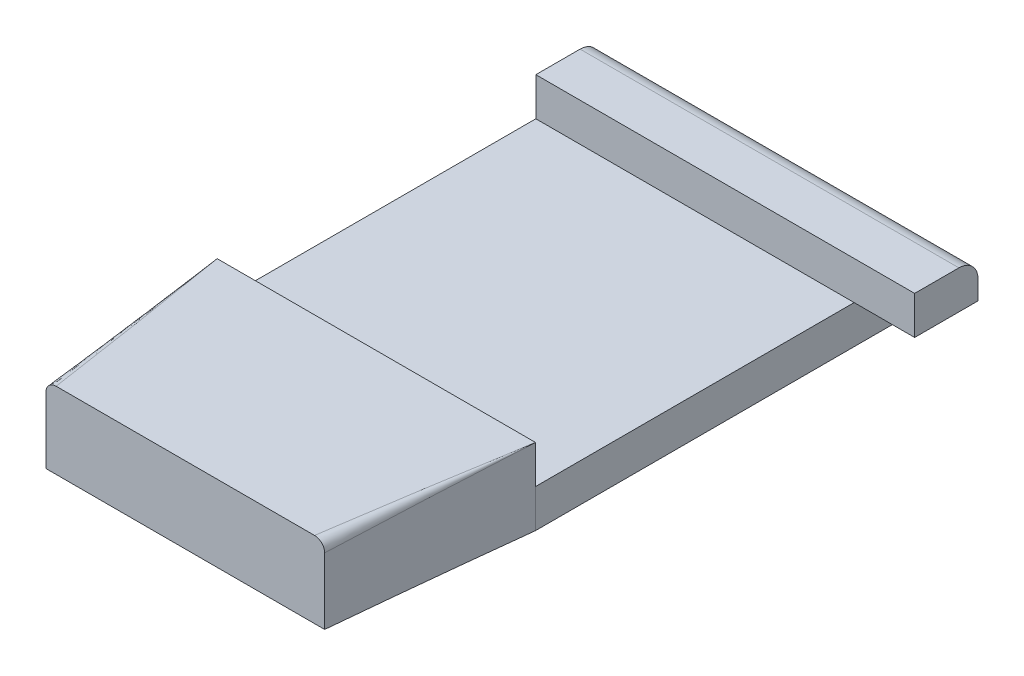
ISO-10303-21;
HEADER;
FILE_DESCRIPTION(('STEP AP214'),'2;1');
FILE_NAME('part.step','',(''),(''),'','','');
FILE_SCHEMA(('AUTOMOTIVE_DESIGN { 1 0 10303 214 1 1 1 1 }'));
ENDSEC;
DATA;
#1=APPLICATION_CONTEXT('core data for automotive mechanical design processes');
#2=APPLICATION_PROTOCOL_DEFINITION('international standard','automotive_design',2000,#1);
#3=PRODUCT_CONTEXT('',#1,'mechanical');
#4=PRODUCT('Part','Part','',(#3));
#5=PRODUCT_RELATED_PRODUCT_CATEGORY('part','',(#4));
#6=PRODUCT_DEFINITION_FORMATION('','',#4);
#7=PRODUCT_DEFINITION_CONTEXT('part definition',#1,'design');
#8=PRODUCT_DEFINITION('design','',#6,#7);
#9=PRODUCT_DEFINITION_SHAPE('','',#8);
#10=(LENGTH_UNIT() NAMED_UNIT(*) SI_UNIT(.MILLI.,.METRE.));
#11=(NAMED_UNIT(*) PLANE_ANGLE_UNIT() SI_UNIT($,.RADIAN.));
#12=(NAMED_UNIT(*) SI_UNIT($,.STERADIAN.) SOLID_ANGLE_UNIT());
#13=UNCERTAINTY_MEASURE_WITH_UNIT(LENGTH_MEASURE(1.E-05),#10,'distance_accuracy_value','');
#14=(GEOMETRIC_REPRESENTATION_CONTEXT(3) GLOBAL_UNCERTAINTY_ASSIGNED_CONTEXT((#13)) GLOBAL_UNIT_ASSIGNED_CONTEXT((#10,
#11,#12)) REPRESENTATION_CONTEXT('',''));
#15=CARTESIAN_POINT('',(0.,0.,0.));
#16=DIRECTION('',(0.,0.,1.));
#17=DIRECTION('',(1.,0.,0.));
#18=AXIS2_PLACEMENT_3D('',#15,#16,#17);
#19=CARTESIAN_POINT('',(0.,3.,0.));
#20=DIRECTION('',(0.,1.,0.));
#21=DIRECTION('',(0.,0.,1.));
#22=AXIS2_PLACEMENT_3D('',#19,#20,#21);
#23=PLANE('',#22);
#24=DIRECTION('',(0.,0.,1.));
#25=VECTOR('',#24,1.);
#26=CARTESIAN_POINT('',(106.597267150879,3.,30.));
#27=LINE('',#26,#25);
#28=CARTESIAN_POINT('',(106.597267150879,3.,4.975));
#29=VERTEX_POINT('',#28);
#30=CARTESIAN_POINT('',(106.597267150879,3.,30.));
#31=VERTEX_POINT('',#30);
#32=EDGE_CURVE('E347',#29,#31,#27,.T.);
#33=ORIENTED_EDGE('',*,*,#32,.F.);
#34=DIRECTION('',(1.,0.,0.));
#35=VECTOR('',#34,1.);
#36=CARTESIAN_POINT('',(81.5972671508789,3.,4.975));
#37=LINE('',#36,#35);
#38=CARTESIAN_POINT('',(81.5972671508789,3.,4.975));
#39=VERTEX_POINT('',#38);
#40=EDGE_CURVE('E329',#39,#29,#37,.T.);
#41=ORIENTED_EDGE('',*,*,#40,.F.);
#42=DIRECTION('',(0.,0.,-1.));
#43=VECTOR('',#42,1.);
#44=CARTESIAN_POINT('',(81.5972671508789,3.,30.));
#45=LINE('',#44,#43);
#46=CARTESIAN_POINT('',(81.5972671508789,3.,30.));
#47=VERTEX_POINT('',#46);
#48=EDGE_CURVE('E350',#47,#39,#45,.T.);
#49=ORIENTED_EDGE('',*,*,#48,.F.);
#50=DIRECTION('',(-1.,0.,0.));
#51=VECTOR('',#50,1.);
#52=CARTESIAN_POINT('',(106.597267150879,3.,30.));
#53=LINE('',#52,#51);
#54=EDGE_CURVE('E346',#31,#47,#53,.T.);
#55=ORIENTED_EDGE('',*,*,#54,.F.);
#56=EDGE_LOOP('',(#33,#41,#49,#55));
#57=FACE_BOUND('',#56,.T.);
#58=ADVANCED_FACE('F43',(#57),#23,.T.);
#59=CARTESIAN_POINT('',(0.,6.,30.));
#60=DIRECTION('',(0.,0.,-1.));
#61=DIRECTION('',(-1.,0.,0.));
#62=AXIS2_PLACEMENT_3D('',#59,#60,#61);
#63=PLANE('',#62);
#64=DIRECTION('',(0.,-1.,0.));
#65=VECTOR('',#64,1.);
#66=CARTESIAN_POINT('',(106.597267150879,6.,30.));
#67=LINE('',#66,#65);
#68=CARTESIAN_POINT('',(106.597267150879,6.,30.));
#69=VERTEX_POINT('',#68);
#70=EDGE_CURVE('E284',#69,#31,#67,.T.);
#71=ORIENTED_EDGE('',*,*,#70,.T.);
#72=ORIENTED_EDGE('',*,*,#54,.T.);
#73=DIRECTION('',(0.,-1.,0.));
#74=VECTOR('',#73,1.);
#75=CARTESIAN_POINT('',(81.5972671508789,6.,30.));
#76=LINE('',#75,#74);
#77=CARTESIAN_POINT('',(81.5972671508789,6.,30.));
#78=VERTEX_POINT('',#77);
#79=EDGE_CURVE('E263',#78,#47,#76,.T.);
#80=ORIENTED_EDGE('',*,*,#79,.F.);
#81=DIRECTION('',(1.,0.,0.));
#82=VECTOR('',#81,1.);
#83=CARTESIAN_POINT('',(0.,6.,30.));
#84=LINE('',#83,#82);
#85=EDGE_CURVE('E373',#78,#69,#84,.T.);
#86=ORIENTED_EDGE('',*,*,#85,.T.);
#87=EDGE_LOOP('',(#71,#72,#80,#86));
#88=FACE_BOUND('',#87,.T.);
#89=ADVANCED_FACE('F195',(#88),#63,.T.);
#90=CARTESIAN_POINT('',(-663.570499194392,6.,115.));
#91=DIRECTION('',(0.,-1.,0.));
#92=DIRECTION('',(0.,0.,-1.));
#93=AXIS2_PLACEMENT_3D('',#90,#91,#92);
#94=CYLINDRICAL_SURFACE('',#93,750.);
#95=CARTESIAN_POINT('',(-663.570499194392,0.,115.));
#96=DIRECTION('',(0.,1.,0.));
#97=DIRECTION('',(0.,0.,1.));
#98=AXIS2_PLACEMENT_3D('',#95,#96,#97);
#99=CIRCLE('',#98,750.);
#100=CARTESIAN_POINT('',(81.5972671508789,0.,30.));
#101=VERTEX_POINT('',#100);
#102=CARTESIAN_POINT('',(83.155688909387,0.,45.));
#103=VERTEX_POINT('',#102);
#104=EDGE_CURVE('E155',#101,#103,#99,.F.);
#105=ORIENTED_EDGE('',*,*,#104,.T.);
#106=DIRECTION('',(0.,-1.,0.));
#107=VECTOR('',#106,1.);
#108=CARTESIAN_POINT('',(83.155688909387,6.,45.));
#109=LINE('',#108,#107);
#110=CARTESIAN_POINT('',(83.1556761300614,5.21164546671452,45.0000001965936));
#111=VERTEX_POINT('',#110);
#112=EDGE_CURVE('E141',#103,#111,#109,.F.);
#113=ORIENTED_EDGE('',*,*,#112,.T.);
#114=CARTESIAN_POINT('',(81.5972671508788,6.,29.9999999999994));
#115=CARTESIAN_POINT('',(83.2062799317841,5.24999994127888,44.1056995290375));
#116=CARTESIAN_POINT('',(84.4146625646699,4.49999999996592,58.2570935038831));
#117=CARTESIAN_POINT('',(85.6233705449503,3.65625000001701,79.5185195161014));
#118=CARTESIAN_POINT('',(85.9256490779134,3.42187499998134,86.6113819054473));
#119=CARTESIAN_POINT('',(86.3287142104268,3.09375000001865,100.802829606762));
#120=CARTESIAN_POINT('',(86.429500805608,3.,107.901414764918));
#121=CARTESIAN_POINT('',(86.4295008056084,3.,122.098585235081));
#122=CARTESIAN_POINT('',(86.3287142104264,3.09375000001866,129.197170393242));
#123=CARTESIAN_POINT('',(85.9256490779138,3.42187499998135,143.388618094551));
#124=CARTESIAN_POINT('',(85.6233705449534,3.65625000001705,150.481480483837));
#125=CARTESIAN_POINT('',(84.4146625646635,4.49999999996596,171.742906496244));
#126=CARTESIAN_POINT('',(83.2062799317906,5.24999994055407,185.894300470906));
#127=CARTESIAN_POINT('',(81.5972671508789,6.,200.));
#128=(BOUNDED_CURVE() B_SPLINE_CURVE(3,(#114,#115,#116,#117,#118,#119,#120,#121,#122,#123,#124,
#125,#126,#127),.UNSPECIFIED.,.F.,.F.) B_SPLINE_CURVE_WITH_KNOTS((4,2,2,2,2,2,4),
(1.45721896303359,1.51400764491425,1.54240198585457,1.5707963267949,1.59919066773522,
1.62758500867555,1.6843736905562),
.UNSPECIFIED.) CURVE() GEOMETRIC_REPRESENTATION_ITEM() RATIONAL_B_SPLINE_CURVE((1.,1.,1.,1.,1.,
1.,1.,1.,1.,1.,1.,1.,1.,1.)) REPRESENTATION_ITEM(''));
#129=EDGE_CURVE('E57',#111,#78,#128,.F.);
#130=ORIENTED_EDGE('',*,*,#129,.T.);
#131=ORIENTED_EDGE('',*,*,#79,.T.);
#132=DIRECTION('',(0.,-1.,0.));
#133=VECTOR('',#132,1.);
#134=CARTESIAN_POINT('',(81.5972671508789,3.,30.));
#135=LINE('',#134,#133);
#136=EDGE_CURVE('E366',#47,#101,#135,.T.);
#137=ORIENTED_EDGE('',*,*,#136,.T.);
#138=EDGE_LOOP('',(#105,#113,#130,#131,#137));
#139=FACE_BOUND('',#138,.T.);
#140=ADVANCED_FACE('F149',(#139),#94,.F.);
#141=CARTESIAN_POINT('',(851.76503349615,6.,115.));
#142=DIRECTION('',(0.,-1.,0.));
#143=DIRECTION('',(0.,0.,-1.));
#144=AXIS2_PLACEMENT_3D('',#141,#142,#143);
#145=CYLINDRICAL_SURFACE('',#144,750.);
#146=CARTESIAN_POINT('',(106.597267150879,6.,199.999999999997));
#147=CARTESIAN_POINT('',(104.98825436999,5.24999993713063,185.894300471102));
#148=CARTESIAN_POINT('',(103.779871737092,4.49999999996471,171.742906496225));
#149=CARTESIAN_POINT('',(102.571163756806,3.65625000001776,150.481480483848));
#150=CARTESIAN_POINT('',(102.268885223843,3.42187499998477,143.388618094539));
#151=CARTESIAN_POINT('',(101.865820091332,3.09375000001516,129.19717039325));
#152=CARTESIAN_POINT('',(101.765033496149,3.00000000000154,122.09858523508));
#153=CARTESIAN_POINT('',(101.76503349615,2.99999999999846,107.901414764917));
#154=CARTESIAN_POINT('',(101.86582009133,3.09375000001831,100.80282960676));
#155=CARTESIAN_POINT('',(102.268885223845,3.42187499998177,86.6113819054441));
#156=CARTESIAN_POINT('',(102.571163756806,3.65625000001452,79.518519516112));
#157=CARTESIAN_POINT('',(103.77987173709,4.4999999999707,58.2570935038658));
#158=CARTESIAN_POINT('',(104.988254369975,5.24999994073761,44.1056995290216));
#159=CARTESIAN_POINT('',(106.597267150879,6.,29.9999999999994));
#160=(BOUNDED_CURVE() B_SPLINE_CURVE(3,(#146,#147,#148,#149,#150,#151,#152,#153,#154,#155,#156,
#157,#158,#159),.UNSPECIFIED.,.F.,.F.) B_SPLINE_CURVE_WITH_KNOTS((4,2,2,2,2,2,4),
(4.59881161662339,4.65560029850404,4.68399463944436,4.71238898038469,4.74078332132502,
4.76917766226534,4.82596634414599),
.UNSPECIFIED.) CURVE() GEOMETRIC_REPRESENTATION_ITEM() RATIONAL_B_SPLINE_CURVE((1.,1.,1.,1.,1.,
1.,1.,1.,1.,1.,1.,1.,1.,1.)) REPRESENTATION_ITEM(''));
#161=CARTESIAN_POINT('',(105.038853887454,5.21165708840962,45.0000003921199));
#162=VERTEX_POINT('',#161);
#163=EDGE_CURVE('E381',#69,#162,#160,.F.);
#164=ORIENTED_EDGE('',*,*,#163,.T.);
#165=DIRECTION('',(0.,-1.,0.));
#166=VECTOR('',#165,1.);
#167=CARTESIAN_POINT('',(105.038845392371,6.,45.));
#168=LINE('',#167,#166);
#169=CARTESIAN_POINT('',(105.038845392371,0.,45.));
#170=VERTEX_POINT('',#169);
#171=EDGE_CURVE('E314',#162,#170,#168,.T.);
#172=ORIENTED_EDGE('',*,*,#171,.T.);
#173=CARTESIAN_POINT('',(851.76503349615,0.,115.));
#174=DIRECTION('',(0.,1.,0.));
#175=DIRECTION('',(0.,0.,1.));
#176=AXIS2_PLACEMENT_3D('',#173,#174,#175);
#177=CIRCLE('',#176,750.);
#178=CARTESIAN_POINT('',(106.597267150879,0.,30.));
#179=VERTEX_POINT('',#178);
#180=EDGE_CURVE('E371',#170,#179,#177,.F.);
#181=ORIENTED_EDGE('',*,*,#180,.T.);
#182=DIRECTION('',(0.,-1.,0.));
#183=VECTOR('',#182,1.);
#184=CARTESIAN_POINT('',(106.597267150879,3.,30.));
#185=LINE('',#184,#183);
#186=EDGE_CURVE('E353',#31,#179,#185,.T.);
#187=ORIENTED_EDGE('',*,*,#186,.F.);
#188=ORIENTED_EDGE('',*,*,#70,.F.);
#189=EDGE_LOOP('',(#164,#172,#181,#187,#188));
#190=FACE_BOUND('',#189,.T.);
#191=ADVANCED_FACE('F194',(#190),#145,.F.);
#192=CARTESIAN_POINT('',(0.,6.,0.));
#193=DIRECTION('',(0.,1.,0.));
#194=DIRECTION('',(0.,0.,1.));
#195=AXIS2_PLACEMENT_3D('',#192,#193,#194);
#196=PLANE('',#195);
#197=DIRECTION('',(-1.,0.,0.));
#198=VECTOR('',#197,1.);
#199=CARTESIAN_POINT('',(0.,6.,45.));
#200=LINE('',#199,#198);
#201=CARTESIAN_POINT('',(104.243337477084,6.,45.0000000007444));
#202=VERTEX_POINT('',#201);
#203=CARTESIAN_POINT('',(83.9512141345285,6.,44.9999999998057));
#204=VERTEX_POINT('',#203);
#205=EDGE_CURVE('E64',#202,#204,#200,.T.);
#206=ORIENTED_EDGE('',*,*,#205,.F.);
#207=CARTESIAN_POINT('',(106.597267150879,6.,29.9999999999994));
#208=CARTESIAN_POINT('',(104.243306710969,6.,44.0193882796078));
#209=CARTESIAN_POINT('',(102.284505766993,6.,58.1329769778131));
#210=CARTESIAN_POINT('',(100.230084002653,6.,79.4049822113751));
#211=CARTESIAN_POINT('',(99.6925362995021,6.,86.5122438411736));
#212=CARTESIAN_POINT('',(98.9600047245418,6.,100.746263381872));
#213=CARTESIAN_POINT('',(98.7650334961006,6.,107.873020423946));
#214=CARTESIAN_POINT('',(98.7650334961991,6.,122.12697957605));
#215=CARTESIAN_POINT('',(98.9600047249849,6.,129.253736618124));
#216=CARTESIAN_POINT('',(99.6925362990585,6.,143.487756158823));
#217=CARTESIAN_POINT('',(100.230084002752,6.,150.595017788628));
#218=CARTESIAN_POINT('',(102.284505766796,6.,171.86702302219));
#219=CARTESIAN_POINT('',(104.243306710582,6.,185.98061172048));
#220=CARTESIAN_POINT('',(106.597267150879,6.,199.999999999997));
#221=(BOUNDED_CURVE() B_SPLINE_CURVE(3,(#207,#208,#209,#210,#211,#212,#213,#214,#215,#216,#217,
#218,#219,#220),.UNSPECIFIED.,.F.,.F.) B_SPLINE_CURVE_WITH_KNOTS((4,2,2,2,2,2,4),
(4.59881161662339,4.65560029850404,4.68399463944436,4.71238898038469,4.74078332132502,
4.76917766226534,4.82596634414599),
.UNSPECIFIED.) CURVE() GEOMETRIC_REPRESENTATION_ITEM() RATIONAL_B_SPLINE_CURVE((0.999999999999973,
0.999999999999973,0.999999999999973,0.999999999999973,0.999999999999973,0.999999999999973,
0.999999999999973,0.999999999999973,0.999999999999973,0.999999999999973,0.999999999999973,
0.999999999999973,0.999999999999973,0.999999999999973)) REPRESENTATION_ITEM(''));
#222=EDGE_CURVE('E291',#202,#69,#221,.F.);
#223=ORIENTED_EDGE('',*,*,#222,.T.);
#224=ORIENTED_EDGE('',*,*,#85,.F.);
#225=CARTESIAN_POINT('',(81.5972671508789,6.,200.));
#226=CARTESIAN_POINT('',(83.9512275914429,6.,185.980611720473));
#227=CARTESIAN_POINT('',(85.9100285345366,6.,171.867023022186));
#228=CARTESIAN_POINT('',(87.9644502992186,6.,150.595017788629));
#229=CARTESIAN_POINT('',(88.5019980023426,6.,143.487756158828));
#230=CARTESIAN_POINT('',(89.2345295771292,6.,129.253736618123));
#231=CARTESIAN_POINT('',(89.429500805608,6.,122.126979576007));
#232=CARTESIAN_POINT('',(89.429500805608,6.,107.873020423992));
#233=CARTESIAN_POINT('',(89.2345295771785,6.,100.746263381828));
#234=CARTESIAN_POINT('',(88.5019980022934,6.,86.5122438412223));
#235=CARTESIAN_POINT('',(87.9644502989724,6.,79.4049822114219));
#236=CARTESIAN_POINT('',(85.9100285350292,6.,58.1329769777163));
#237=CARTESIAN_POINT('',(83.9512275903507,6.,44.0193882797219));
#238=CARTESIAN_POINT('',(81.5972671508788,6.,29.9999999999994));
#239=(BOUNDED_CURVE() B_SPLINE_CURVE(3,(#225,#226,#227,#228,#229,#230,#231,#232,#233,#234,#235,
#236,#237,#238),.UNSPECIFIED.,.F.,.F.) B_SPLINE_CURVE_WITH_KNOTS((4,2,2,2,2,2,4),
(1.45721896303359,1.51400764491425,1.54240198585457,1.5707963267949,1.59919066773522,
1.62758500867555,1.6843736905562),
.UNSPECIFIED.) CURVE() GEOMETRIC_REPRESENTATION_ITEM() RATIONAL_B_SPLINE_CURVE((0.99999999999997,
0.99999999999997,0.99999999999997,0.99999999999997,0.99999999999997,0.99999999999997,
0.99999999999997,0.99999999999997,0.99999999999997,0.99999999999997,0.99999999999997,
0.99999999999997,0.99999999999997,0.99999999999997)) REPRESENTATION_ITEM(''));
#240=EDGE_CURVE('E159',#78,#204,#239,.F.);
#241=ORIENTED_EDGE('',*,*,#240,.T.);
#242=EDGE_LOOP('',(#206,#223,#224,#241));
#243=FACE_BOUND('',#242,.T.);
#244=ADVANCED_FACE('F264',(#243),#196,.T.);
#245=CARTESIAN_POINT('',(0.,0.,0.));
#246=DIRECTION('',(0.,1.,0.));
#247=DIRECTION('',(0.,0.,1.));
#248=AXIS2_PLACEMENT_3D('',#245,#246,#247);
#249=PLANE('',#248);
#250=ORIENTED_EDGE('',*,*,#180,.F.);
#251=DIRECTION('',(-1.,0.,0.));
#252=VECTOR('',#251,1.);
#253=CARTESIAN_POINT('',(0.,0.,45.));
#254=LINE('',#253,#252);
#255=EDGE_CURVE('E312',#170,#103,#254,.T.);
#256=ORIENTED_EDGE('',*,*,#255,.T.);
#257=ORIENTED_EDGE('',*,*,#104,.F.);
#258=DIRECTION('',(0.,0.,-1.));
#259=VECTOR('',#258,1.);
#260=CARTESIAN_POINT('',(81.5972671508789,0.,30.));
#261=LINE('',#260,#259);
#262=CARTESIAN_POINT('',(81.5972671508789,0.,0.));
#263=VERTEX_POINT('',#262);
#264=EDGE_CURVE('E356',#101,#263,#261,.T.);
#265=ORIENTED_EDGE('',*,*,#264,.T.);
#266=DIRECTION('',(1.,0.,0.));
#267=VECTOR('',#266,1.);
#268=CARTESIAN_POINT('',(106.597267150879,0.,0.));
#269=LINE('',#268,#267);
#270=CARTESIAN_POINT('',(106.597267150879,0.,0.));
#271=VERTEX_POINT('',#270);
#272=EDGE_CURVE('E359',#263,#271,#269,.T.);
#273=ORIENTED_EDGE('',*,*,#272,.T.);
#274=DIRECTION('',(0.,0.,1.));
#275=VECTOR('',#274,1.);
#276=CARTESIAN_POINT('',(106.597267150879,0.,30.));
#277=LINE('',#276,#275);
#278=EDGE_CURVE('E342',#271,#179,#277,.T.);
#279=ORIENTED_EDGE('',*,*,#278,.T.);
#280=EDGE_LOOP('',(#250,#256,#257,#265,#273,#279));
#281=FACE_BOUND('',#280,.T.);
#282=ADVANCED_FACE('F273',(#281),#249,.F.);
#283=CARTESIAN_POINT('',(106.597267150879,3.,30.));
#284=DIRECTION('',(1.,0.,0.));
#285=DIRECTION('',(0.,0.,-1.));
#286=AXIS2_PLACEMENT_3D('',#283,#284,#285);
#287=PLANE('',#286);
#288=ORIENTED_EDGE('',*,*,#278,.F.);
#289=DIRECTION('',(0.,-1.,0.));
#290=VECTOR('',#289,1.);
#291=CARTESIAN_POINT('',(106.597267150879,3.,0.));
#292=LINE('',#291,#290);
#293=CARTESIAN_POINT('',(106.597267150879,3.,0.));
#294=VERTEX_POINT('',#293);
#295=EDGE_CURVE('E362',#294,#271,#292,.T.);
#296=ORIENTED_EDGE('',*,*,#295,.F.);
#297=EDGE_CURVE('E343',#294,#29,#27,.T.);
#298=ORIENTED_EDGE('',*,*,#297,.T.);
#299=ORIENTED_EDGE('',*,*,#32,.T.);
#300=ORIENTED_EDGE('',*,*,#186,.T.);
#301=EDGE_LOOP('',(#288,#296,#298,#299,#300));
#302=FACE_BOUND('',#301,.T.);
#303=ADVANCED_FACE('F274',(#302),#287,.T.);
#304=CARTESIAN_POINT('',(106.597267150879,3.,0.));
#305=DIRECTION('',(0.,0.,-1.));
#306=DIRECTION('',(-1.,0.,0.));
#307=AXIS2_PLACEMENT_3D('',#304,#305,#306);
#308=PLANE('',#307);
#309=DIRECTION('',(0.,-1.,0.));
#310=VECTOR('',#309,1.);
#311=CARTESIAN_POINT('',(81.5972671508789,3.,0.));
#312=LINE('',#311,#310);
#313=CARTESIAN_POINT('',(81.5972671508789,4.5,0.));
#314=VERTEX_POINT('',#313);
#315=EDGE_CURVE('E364',#314,#263,#312,.T.);
#316=ORIENTED_EDGE('',*,*,#315,.F.);
#317=DIRECTION('',(-1.,0.,0.));
#318=VECTOR('',#317,1.);
#319=CARTESIAN_POINT('',(106.597267150879,4.5,0.));
#320=LINE('',#319,#318);
#321=CARTESIAN_POINT('',(111.347267150879,4.5,0.));
#322=VERTEX_POINT('',#321);
#323=EDGE_CURVE('E72',#314,#322,#320,.F.);
#324=ORIENTED_EDGE('',*,*,#323,.T.);
#325=DIRECTION('',(0.,-1.,0.));
#326=VECTOR('',#325,1.);
#327=CARTESIAN_POINT('',(111.347267150879,6.,0.));
#328=LINE('',#327,#326);
#329=CARTESIAN_POINT('',(111.347267150879,3.,0.));
#330=VERTEX_POINT('',#329);
#331=EDGE_CURVE('E328',#322,#330,#328,.T.);
#332=ORIENTED_EDGE('',*,*,#331,.T.);
#333=DIRECTION('',(-1.,0.,0.));
#334=VECTOR('',#333,1.);
#335=CARTESIAN_POINT('',(81.5972671508789,3.,0.));
#336=LINE('',#335,#334);
#337=EDGE_CURVE('E323',#330,#294,#336,.T.);
#338=ORIENTED_EDGE('',*,*,#337,.T.);
#339=ORIENTED_EDGE('',*,*,#295,.T.);
#340=ORIENTED_EDGE('',*,*,#272,.F.);
#341=EDGE_LOOP('',(#316,#324,#332,#338,#339,#340));
#342=FACE_BOUND('',#341,.T.);
#343=ADVANCED_FACE('F418',(#342),#308,.T.);
#344=CARTESIAN_POINT('',(81.5972671508789,3.,30.));
#345=DIRECTION('',(-1.,0.,0.));
#346=DIRECTION('',(0.,0.,1.));
#347=AXIS2_PLACEMENT_3D('',#344,#345,#346);
#348=PLANE('',#347);
#349=DIRECTION('',(0.,0.,1.));
#350=VECTOR('',#349,1.);
#351=CARTESIAN_POINT('',(81.5972671508789,6.,0.));
#352=LINE('',#351,#350);
#353=CARTESIAN_POINT('',(81.5972671508789,6.,1.5));
#354=VERTEX_POINT('',#353);
#355=CARTESIAN_POINT('',(81.5972671508789,6.,4.975));
#356=VERTEX_POINT('',#355);
#357=EDGE_CURVE('E320',#354,#356,#352,.T.);
#358=ORIENTED_EDGE('',*,*,#357,.F.);
#359=CARTESIAN_POINT('',(81.5972671508789,4.5,1.5));
#360=DIRECTION('',(-1.,0.,0.));
#361=DIRECTION('',(0.,0.,1.));
#362=AXIS2_PLACEMENT_3D('',#359,#360,#361);
#363=CIRCLE('',#362,1.5);
#364=EDGE_CURVE('E377',#354,#314,#363,.T.);
#365=ORIENTED_EDGE('',*,*,#364,.T.);
#366=ORIENTED_EDGE('',*,*,#315,.T.);
#367=ORIENTED_EDGE('',*,*,#264,.F.);
#368=ORIENTED_EDGE('',*,*,#136,.F.);
#369=ORIENTED_EDGE('',*,*,#48,.T.);
#370=DIRECTION('',(0.,-1.,0.));
#371=VECTOR('',#370,1.);
#372=CARTESIAN_POINT('',(81.5972671508789,6.,4.975));
#373=LINE('',#372,#371);
#374=EDGE_CURVE('E340',#356,#39,#373,.T.);
#375=ORIENTED_EDGE('',*,*,#374,.F.);
#376=EDGE_LOOP('',(#358,#365,#366,#367,#368,#369,#375));
#377=FACE_BOUND('',#376,.T.);
#378=ADVANCED_FACE('F416',(#377),#348,.T.);
#379=CARTESIAN_POINT('',(81.5972671508789,6.,4.975));
#380=DIRECTION('',(0.,0.,-1.));
#381=DIRECTION('',(-1.,0.,0.));
#382=AXIS2_PLACEMENT_3D('',#379,#380,#381);
#383=PLANE('',#382);
#384=ORIENTED_EDGE('',*,*,#40,.T.);
#385=CARTESIAN_POINT('',(111.347267150879,3.,4.975));
#386=VERTEX_POINT('',#385);
#387=EDGE_CURVE('E317',#29,#386,#37,.T.);
#388=ORIENTED_EDGE('',*,*,#387,.T.);
#389=DIRECTION('',(0.,-1.,0.));
#390=VECTOR('',#389,1.);
#391=CARTESIAN_POINT('',(111.347267150879,6.,4.975));
#392=LINE('',#391,#390);
#393=CARTESIAN_POINT('',(111.347267150879,6.,4.975));
#394=VERTEX_POINT('',#393);
#395=EDGE_CURVE('E337',#394,#386,#392,.T.);
#396=ORIENTED_EDGE('',*,*,#395,.F.);
#397=DIRECTION('',(1.,0.,0.));
#398=VECTOR('',#397,1.);
#399=CARTESIAN_POINT('',(81.5972671508789,6.,4.975));
#400=LINE('',#399,#398);
#401=EDGE_CURVE('E322',#356,#394,#400,.T.);
#402=ORIENTED_EDGE('',*,*,#401,.F.);
#403=ORIENTED_EDGE('',*,*,#374,.T.);
#404=EDGE_LOOP('',(#384,#388,#396,#402,#403));
#405=FACE_BOUND('',#404,.T.);
#406=ADVANCED_FACE('F424',(#405),#383,.F.);
#407=CARTESIAN_POINT('',(111.347267150879,6.,0.));
#408=DIRECTION('',(-1.,0.,0.));
#409=DIRECTION('',(0.,0.,1.));
#410=AXIS2_PLACEMENT_3D('',#407,#408,#409);
#411=PLANE('',#410);
#412=ORIENTED_EDGE('',*,*,#331,.F.);
#413=CARTESIAN_POINT('',(111.347267150879,4.5,1.5));
#414=DIRECTION('',(-1.,0.,0.));
#415=DIRECTION('',(0.,0.,1.));
#416=AXIS2_PLACEMENT_3D('',#413,#414,#415);
#417=CIRCLE('',#416,1.5);
#418=CARTESIAN_POINT('',(111.347267150879,6.,1.5));
#419=VERTEX_POINT('',#418);
#420=EDGE_CURVE('E282',#322,#419,#417,.F.);
#421=ORIENTED_EDGE('',*,*,#420,.T.);
#422=DIRECTION('',(0.,0.,-1.));
#423=VECTOR('',#422,1.);
#424=CARTESIAN_POINT('',(111.347267150879,6.,0.));
#425=LINE('',#424,#423);
#426=EDGE_CURVE('E325',#394,#419,#425,.T.);
#427=ORIENTED_EDGE('',*,*,#426,.F.);
#428=ORIENTED_EDGE('',*,*,#395,.T.);
#429=DIRECTION('',(0.,0.,-1.));
#430=VECTOR('',#429,1.);
#431=CARTESIAN_POINT('',(111.347267150879,3.,0.));
#432=LINE('',#431,#430);
#433=EDGE_CURVE('E332',#386,#330,#432,.T.);
#434=ORIENTED_EDGE('',*,*,#433,.T.);
#435=EDGE_LOOP('',(#412,#421,#427,#428,#434));
#436=FACE_BOUND('',#435,.T.);
#437=ADVANCED_FACE('F428',(#436),#411,.F.);
#438=CARTESIAN_POINT('',(0.,6.,0.));
#439=DIRECTION('',(0.,1.,0.));
#440=DIRECTION('',(0.,0.,1.));
#441=AXIS2_PLACEMENT_3D('',#438,#439,#440);
#442=PLANE('',#441);
#443=ORIENTED_EDGE('',*,*,#426,.T.);
#444=DIRECTION('',(-1.,0.,0.));
#445=VECTOR('',#444,1.);
#446=CARTESIAN_POINT('',(0.,6.,1.5));
#447=LINE('',#446,#445);
#448=EDGE_CURVE('E374',#419,#354,#447,.T.);
#449=ORIENTED_EDGE('',*,*,#448,.T.);
#450=ORIENTED_EDGE('',*,*,#357,.T.);
#451=ORIENTED_EDGE('',*,*,#401,.T.);
#452=EDGE_LOOP('',(#443,#449,#450,#451));
#453=FACE_BOUND('',#452,.T.);
#454=ADVANCED_FACE('F301',(#453),#442,.T.);
#455=CARTESIAN_POINT('',(0.,3.,0.));
#456=DIRECTION('',(0.,1.,0.));
#457=DIRECTION('',(0.,0.,1.));
#458=AXIS2_PLACEMENT_3D('',#455,#456,#457);
#459=PLANE('',#458);
#460=ORIENTED_EDGE('',*,*,#297,.F.);
#461=ORIENTED_EDGE('',*,*,#337,.F.);
#462=ORIENTED_EDGE('',*,*,#433,.F.);
#463=ORIENTED_EDGE('',*,*,#387,.F.);
#464=EDGE_LOOP('',(#460,#461,#462,#463));
#465=FACE_BOUND('',#464,.T.);
#466=ADVANCED_FACE('F204',(#465),#459,.F.);
#467=CARTESIAN_POINT('',(0.,4.5,1.5));
#468=DIRECTION('',(-1.,0.,0.));
#469=DIRECTION('',(0.,0.,1.));
#470=AXIS2_PLACEMENT_3D('',#467,#468,#469);
#471=CYLINDRICAL_SURFACE('',#470,1.5);
#472=ORIENTED_EDGE('',*,*,#420,.F.);
#473=ORIENTED_EDGE('',*,*,#323,.F.);
#474=ORIENTED_EDGE('',*,*,#364,.F.);
#475=ORIENTED_EDGE('',*,*,#448,.F.);
#476=EDGE_LOOP('',(#472,#473,#474,#475));
#477=FACE_BOUND('',#476,.T.);
#478=ADVANCED_FACE('F201',(#477),#471,.T.);
#479=CARTESIAN_POINT('',(106.597267150879,6.,29.9999999999994));
#480=CARTESIAN_POINT('',(104.988254369975,5.24999994073761,44.1056995290216));
#481=CARTESIAN_POINT('',(103.77987173709,4.4999999999707,58.2570935038658));
#482=CARTESIAN_POINT('',(102.571163756806,3.65625000001452,79.518519516112));
#483=CARTESIAN_POINT('',(102.268885223845,3.42187499998177,86.6113819054441));
#484=CARTESIAN_POINT('',(101.86582009133,3.09375000001831,100.80282960676));
#485=CARTESIAN_POINT('',(101.76503349615,2.99999999999846,107.901414764917));
#486=CARTESIAN_POINT('',(101.765033496149,3.00000000000154,122.09858523508));
#487=CARTESIAN_POINT('',(101.865820091332,3.09375000001516,129.19717039325));
#488=CARTESIAN_POINT('',(102.268885223843,3.42187499998477,143.388618094539));
#489=CARTESIAN_POINT('',(102.571163756806,3.65625000001776,150.481480483848));
#490=CARTESIAN_POINT('',(103.779871737092,4.49999999996471,171.742906496225));
#491=CARTESIAN_POINT('',(104.98825436999,5.24999993713063,185.894300471102));
#492=CARTESIAN_POINT('',(106.597267150879,6.,199.999999999997));
#493=CARTESIAN_POINT('',(106.597267150879,6.,29.9999999999994));
#494=CARTESIAN_POINT('',(104.988254368572,5.99999999990764,44.1056995319905));
#495=CARTESIAN_POINT('',(103.779871736552,6.00000000009851,58.2570935038352));
#496=CARTESIAN_POINT('',(102.571163757075,5.99999999995074,79.5185195161273));
#497=CARTESIAN_POINT('',(102.26888522397,6.,86.6113819054477));
#498=CARTESIAN_POINT('',(101.865820091205,6.,100.802829606757));
#499=CARTESIAN_POINT('',(101.7650334961,6.,107.901414764868));
#500=CARTESIAN_POINT('',(101.765033496199,6.,122.098585235129));
#501=CARTESIAN_POINT('',(101.865820091697,5.99999999995074,129.19717039324));
#502=CARTESIAN_POINT('',(102.268885223478,6.00000000004926,143.388618094549));
#503=CARTESIAN_POINT('',(102.571163757174,6.00000000004926,150.481480483827));
#504=CARTESIAN_POINT('',(103.779871736356,5.99999999990149,171.742906496267));
#505=CARTESIAN_POINT('',(104.988254371274,6.00000000009851,185.894300467643));
#506=CARTESIAN_POINT('',(106.597267150879,6.,199.999999999997));
#507=CARTESIAN_POINT('',(106.597267150879,6.,29.9999999999994));
#508=CARTESIAN_POINT('',(104.243306710969,6.,44.0193882796078));
#509=CARTESIAN_POINT('',(102.284505766993,6.,58.1329769778131));
#510=CARTESIAN_POINT('',(100.230084002653,6.,79.4049822113751));
#511=CARTESIAN_POINT('',(99.6925362995019,6.,86.5122438411736));
#512=CARTESIAN_POINT('',(98.9600047245416,6.,100.746263381872));
#513=CARTESIAN_POINT('',(98.7650334961004,6.,107.873020423946));
#514=CARTESIAN_POINT('',(98.7650334961989,6.,122.12697957605));
#515=CARTESIAN_POINT('',(98.9600047249847,6.,129.253736618124));
#516=CARTESIAN_POINT('',(99.6925362990583,6.,143.487756158823));
#517=CARTESIAN_POINT('',(100.230084002752,6.,150.595017788628));
#518=CARTESIAN_POINT('',(102.284505766796,6.,171.86702302219));
#519=CARTESIAN_POINT('',(104.243306710582,6.,185.98061172048));
#520=CARTESIAN_POINT('',(106.597267150879,6.,199.999999999997));
#521=(BOUNDED_SURFACE() B_SPLINE_SURFACE(2,3,((#479,#480,#481,#482,#483,#484,#485,#486,#487,
#488,#489,#490,#491,#492),(#493,#494,#495,#496,#497,#498,#499,#500,#501,#502,#503,#504,#505,
#506),(#507,#508,#509,#510,#511,#512,#513,#514,#515,#516,#517,#518,#519,#520)),.UNSPECIFIED.,
.F.,.F.,.F.) B_SPLINE_SURFACE_WITH_KNOTS((3,3),(4,2,2,2,2,2,4),(0.,1.),(4.59881161662339,
4.65560029850404,4.68399463944436,4.71238898038469,4.74078332132502,4.76917766226534,
4.82596634414599),.UNSPECIFIED.) GEOMETRIC_REPRESENTATION_ITEM() RATIONAL_B_SPLINE_SURFACE(((1.,
1.,1.,1.,1.,1.,1.,1.,1.,1.,1.,1.,1.,1.),(0.707106781186548,0.70710678118655,0.707106781186548,
0.707106781186548,0.707106781186547,0.707106781186547,0.707106781186547,0.707106781186547,
0.707106781186547,0.707106781186547,0.707106781186548,0.707106781186548,0.707106781186547,
0.707106781186548),(1.,1.,1.,1.,1.,1.,1.,1.,1.,1.,1.,1.,1.,1.))) REPRESENTATION_ITEM('') SURFACE());
#522=CARTESIAN_POINT('',(105.038862455739,5.21163382353432,45.0000000016276));
#523=CARTESIAN_POINT('',(105.038902311491,5.255745686639,45.0000000005845));
#524=CARTESIAN_POINT('',(105.035146571757,5.29984706318797,45.0000000001566));
#525=CARTESIAN_POINT('',(105.020319708499,5.38676266287701,44.9999999998435));
#526=CARTESIAN_POINT('',(105.009255261602,5.42957802352858,44.9999999999578));
#527=CARTESIAN_POINT('',(104.980080366297,5.51275607564475,45.0000000000417));
#528=CARTESIAN_POINT('',(104.961967257308,5.55311783431659,45.0000000000112));
#529=CARTESIAN_POINT('',(104.919237413694,5.63022730149946,44.9999999999888));
#530=CARTESIAN_POINT('',(104.894621687359,5.66697556910473,44.9999999999968));
#531=CARTESIAN_POINT('',(104.83955078425,5.73589970330173,45.0000000000028));
#532=CARTESIAN_POINT('',(104.809085863795,5.7680677821925,45.0000000000008));
#533=CARTESIAN_POINT('',(104.74322156016,5.82687883081963,44.9999999999992));
#534=CARTESIAN_POINT('',(104.707821901841,5.85352149227718,44.9999999999998));
#535=CARTESIAN_POINT('',(104.63281476114,5.9007476732354,45.0000000000001));
#536=CARTESIAN_POINT('',(104.593177254402,5.92128344653814,44.9999999999999));
#537=CARTESIAN_POINT('',(104.511046266489,5.95547547816086,45.0000000000001));
#538=CARTESIAN_POINT('',(104.468553984916,5.9691346058669,45.0000000000004));
#539=CARTESIAN_POINT('',(104.395424131849,5.98610537937621,45.0000000000003));
#540=CARTESIAN_POINT('',(104.365212374146,5.99131431401727,45.0000000000001));
#541=CARTESIAN_POINT('',(104.304437403126,5.9982613257106,44.9999999999999));
#542=CARTESIAN_POINT('',(104.273874771942,6.00000449529664,44.9999999999999));
#543=CARTESIAN_POINT('',(104.243300160692,6.,45.0000000000003));
#544=B_SPLINE_CURVE_WITH_KNOTS('',3,(#522,#523,#524,#525,#526,#527,#528,#529,#530,#531,#532,
#533,#534,#535,#536,#537,#538,#539,#540,#541,#542,#543),.UNSPECIFIED.,.F.,.F.,(4,2,2,2,2,2,2,2,
2,2,4),(0.,0.132160593393677,0.264200622521935,0.396290539730097,0.528359987176525,
0.660651377357495,0.792950146468563,0.926257616336146,1.0595094154147,1.15129493614474,
1.24294548888753),.UNSPECIFIED.);
#545=EDGE_CURVE('E156',#162,#202,#544,.T.);
#546=ORIENTED_EDGE('',*,*,#545,.F.);
#547=ORIENTED_EDGE('',*,*,#163,.F.);
#548=ORIENTED_EDGE('',*,*,#222,.F.);
#549=EDGE_LOOP('',(#546,#547,#548));
#550=FACE_BOUND('',#549,.T.);
#551=ADVANCED_FACE('F203',(#550),#521,.T.);
#552=CARTESIAN_POINT('',(81.5972671508789,6.,200.));
#553=CARTESIAN_POINT('',(83.2062799317906,5.24999994055407,185.894300470906));
#554=CARTESIAN_POINT('',(84.4146625646635,4.49999999996596,171.742906496244));
#555=CARTESIAN_POINT('',(85.6233705449534,3.65625000001705,150.481480483837));
#556=CARTESIAN_POINT('',(85.9256490779138,3.42187499998135,143.388618094551));
#557=CARTESIAN_POINT('',(86.3287142104264,3.09375000001866,129.197170393242));
#558=CARTESIAN_POINT('',(86.4295008056084,3.,122.098585235081));
#559=CARTESIAN_POINT('',(86.429500805608,3.,107.901414764918));
#560=CARTESIAN_POINT('',(86.3287142104268,3.09375000001865,100.802829606762));
#561=CARTESIAN_POINT('',(85.9256490779134,3.42187499998134,86.6113819054473));
#562=CARTESIAN_POINT('',(85.6233705449503,3.65625000001701,79.5185195161014));
#563=CARTESIAN_POINT('',(84.4146625646699,4.49999999996592,58.2570935038831));
#564=CARTESIAN_POINT('',(83.2062799317841,5.24999994127888,44.1056995290375));
#565=CARTESIAN_POINT('',(81.5972671508788,6.,29.9999999999994));
#566=CARTESIAN_POINT('',(81.5972671508789,6.,200.));
#567=CARTESIAN_POINT('',(83.2062799339284,6.,185.894300468001));
#568=CARTESIAN_POINT('',(84.4146625649726,6.,171.742906496262));
#569=CARTESIAN_POINT('',(85.6233705447989,6.,150.481480483828));
#570=CARTESIAN_POINT('',(85.9256490779016,6.00000000004927,143.38861809455));
#571=CARTESIAN_POINT('',(86.3287142104386,5.99999999995076,129.197170393242));
#572=CARTESIAN_POINT('',(86.4295008056082,6.,122.098585235081));
#573=CARTESIAN_POINT('',(86.4295008056082,6.,107.901414764918));
#574=CARTESIAN_POINT('',(86.3287142105372,6.,100.802829606709));
#575=CARTESIAN_POINT('',(85.9256490778031,6.,86.6113819054997));
#576=CARTESIAN_POINT('',(85.6233705445527,6.,79.518519516124));
#577=CARTESIAN_POINT('',(84.4146625654652,6.,58.2570935038378));
#578=CARTESIAN_POINT('',(83.2062799333121,6.,44.1056995319526));
#579=CARTESIAN_POINT('',(81.5972671508788,6.,29.9999999999994));
#580=CARTESIAN_POINT('',(81.5972671508789,6.,200.));
#581=CARTESIAN_POINT('',(83.9512275914429,6.,185.980611720473));
#582=CARTESIAN_POINT('',(85.9100285345367,6.,171.867023022186));
#583=CARTESIAN_POINT('',(87.9644502992188,6.,150.595017788629));
#584=CARTESIAN_POINT('',(88.5019980023427,6.,143.487756158828));
#585=CARTESIAN_POINT('',(89.2345295771294,6.,129.253736618123));
#586=CARTESIAN_POINT('',(89.4295008056082,6.,122.126979576007));
#587=CARTESIAN_POINT('',(89.4295008056082,6.,107.873020423992));
#588=CARTESIAN_POINT('',(89.2345295771787,6.,100.746263381828));
#589=CARTESIAN_POINT('',(88.5019980022935,6.,86.5122438412223));
#590=CARTESIAN_POINT('',(87.9644502989726,6.,79.4049822114218));
#591=CARTESIAN_POINT('',(85.9100285350293,6.,58.1329769777162));
#592=CARTESIAN_POINT('',(83.9512275903507,6.,44.0193882797219));
#593=CARTESIAN_POINT('',(81.5972671508788,6.,29.9999999999994));
#594=(BOUNDED_SURFACE() B_SPLINE_SURFACE(2,3,((#552,#553,#554,#555,#556,#557,#558,#559,#560,
#561,#562,#563,#564,#565),(#566,#567,#568,#569,#570,#571,#572,#573,#574,#575,#576,#577,#578,
#579),(#580,#581,#582,#583,#584,#585,#586,#587,#588,#589,#590,#591,#592,#593)),.UNSPECIFIED.,
.F.,.F.,.F.) B_SPLINE_SURFACE_WITH_KNOTS((3,3),(4,2,2,2,2,2,4),(0.,1.),(1.45721896303359,
1.51400764491425,1.54240198585457,1.5707963267949,1.59919066773522,1.62758500867555,
1.6843736905562),.UNSPECIFIED.) GEOMETRIC_REPRESENTATION_ITEM() RATIONAL_B_SPLINE_SURFACE(((1.,
1.,1.,1.,1.,1.,1.,1.,1.,1.,1.,1.,1.,1.),(0.707106781186548,0.707106781186547,0.707106781186548,
0.707106781186548,0.707106781186546,0.707106781186546,0.707106781186547,0.707106781186547,
0.707106781186548,0.707106781186548,0.707106781186548,0.707106781186548,0.707106781186548,
0.707106781186548),(1.,1.,1.,1.,1.,1.,1.,1.,1.,1.,1.,1.,1.,1.))) REPRESENTATION_ITEM('') SURFACE());
#595=CARTESIAN_POINT('',(83.9512341409323,6.,44.9999999988065));
#596=CARTESIAN_POINT('',(83.9059686102458,6.00003735317027,44.9999999995715));
#597=CARTESIAN_POINT('',(83.8607088185133,5.99619201501083,44.9999999998852));
#598=CARTESIAN_POINT('',(83.7714869259581,5.98098672158412,45.0000000001147));
#599=CARTESIAN_POINT('',(83.7275243264123,5.96962969467049,45.0000000000307));
#600=CARTESIAN_POINT('',(83.6421620066158,5.93965712771212,44.9999999999692));
#601=CARTESIAN_POINT('',(83.6007613187074,5.92104434786375,44.9999999999918));
#602=CARTESIAN_POINT('',(83.5217240566686,5.8770778593413,45.0000000000082));
#603=CARTESIAN_POINT('',(83.484086285505,5.85172630380978,45.0000000000022));
#604=CARTESIAN_POINT('',(83.4139949969558,5.79523649398588,44.9999999999979));
#605=CARTESIAN_POINT('',(83.3814979841226,5.76415221534389,44.9999999999994));
#606=CARTESIAN_POINT('',(83.3222487827963,5.69692178419511,45.0000000000006));
#607=CARTESIAN_POINT('',(83.2954960249285,5.66077613396242,45.0000000000002));
#608=CARTESIAN_POINT('',(83.2487557075423,5.58482224968077,44.9999999999999));
#609=CARTESIAN_POINT('',(83.2287068809454,5.54505166416062,45.));
#610=CARTESIAN_POINT('',(83.1956295423014,5.46270397274133,45.));
#611=CARTESIAN_POINT('',(83.1825962126134,5.4201288153891,45.0000000000001));
#612=CARTESIAN_POINT('',(83.1674082325352,5.34965110537848,45.));
#613=CARTESIAN_POINT('',(83.1630082852642,5.32221201240629,45.));
#614=CARTESIAN_POINT('',(83.1571408315618,5.2670637871622,45.));
#615=CARTESIAN_POINT('',(83.1556689293624,5.2393551225331,45.));
#616=CARTESIAN_POINT('',(83.155671845714,5.21163382384909,45.0000000000001));
#617=B_SPLINE_CURVE_WITH_KNOTS('',3,(#595,#596,#597,#598,#599,#600,#601,#602,#603,#604,#605,
#606,#607,#608,#609,#610,#611,#612,#613,#614,#615,#616),.UNSPECIFIED.,.F.,.F.,(4,2,2,2,2,2,2,2,
2,2,4),(0.,0.135625944273604,0.271199047323828,0.406720626598413,0.542198956583471,
0.676461413152874,0.810710555381345,0.94369693913387,1.07659188236833,1.15981686117651,
1.24291680276056),.UNSPECIFIED.);
#618=EDGE_CURVE('E12',#204,#111,#617,.T.);
#619=ORIENTED_EDGE('',*,*,#618,.F.);
#620=ORIENTED_EDGE('',*,*,#240,.F.);
#621=ORIENTED_EDGE('',*,*,#129,.F.);
#622=EDGE_LOOP('',(#619,#620,#621));
#623=FACE_BOUND('',#622,.T.);
#624=ADVANCED_FACE('F46',(#623),#594,.T.);
#625=CARTESIAN_POINT('',(0.,0.,45.));
#626=DIRECTION('',(0.,0.,-1.));
#627=DIRECTION('',(-1.,0.,0.));
#628=AXIS2_PLACEMENT_3D('',#625,#626,#627);
#629=PLANE('',#628);
#630=ORIENTED_EDGE('',*,*,#545,.T.);
#631=ORIENTED_EDGE('',*,*,#205,.T.);
#632=ORIENTED_EDGE('',*,*,#618,.T.);
#633=ORIENTED_EDGE('',*,*,#112,.F.);
#634=ORIENTED_EDGE('',*,*,#255,.F.);
#635=ORIENTED_EDGE('',*,*,#171,.F.);
#636=EDGE_LOOP('',(#630,#631,#632,#633,#634,#635));
#637=FACE_BOUND('',#636,.T.);
#638=ADVANCED_FACE('F140',(#637),#629,.F.);
#639=CLOSED_SHELL('',(#58,#89,#140,#191,#244,#282,#303,#343,#378,#406,#437,#454,#466,#478,#551,
#624,#638));
#640=MANIFOLD_SOLID_BREP('B2',#639);
#641=ADVANCED_BREP_SHAPE_REPRESENTATION('',(#18,#640),#14);
#642=SHAPE_DEFINITION_REPRESENTATION(#9,#641);
ENDSEC;
END-ISO-10303-21;
